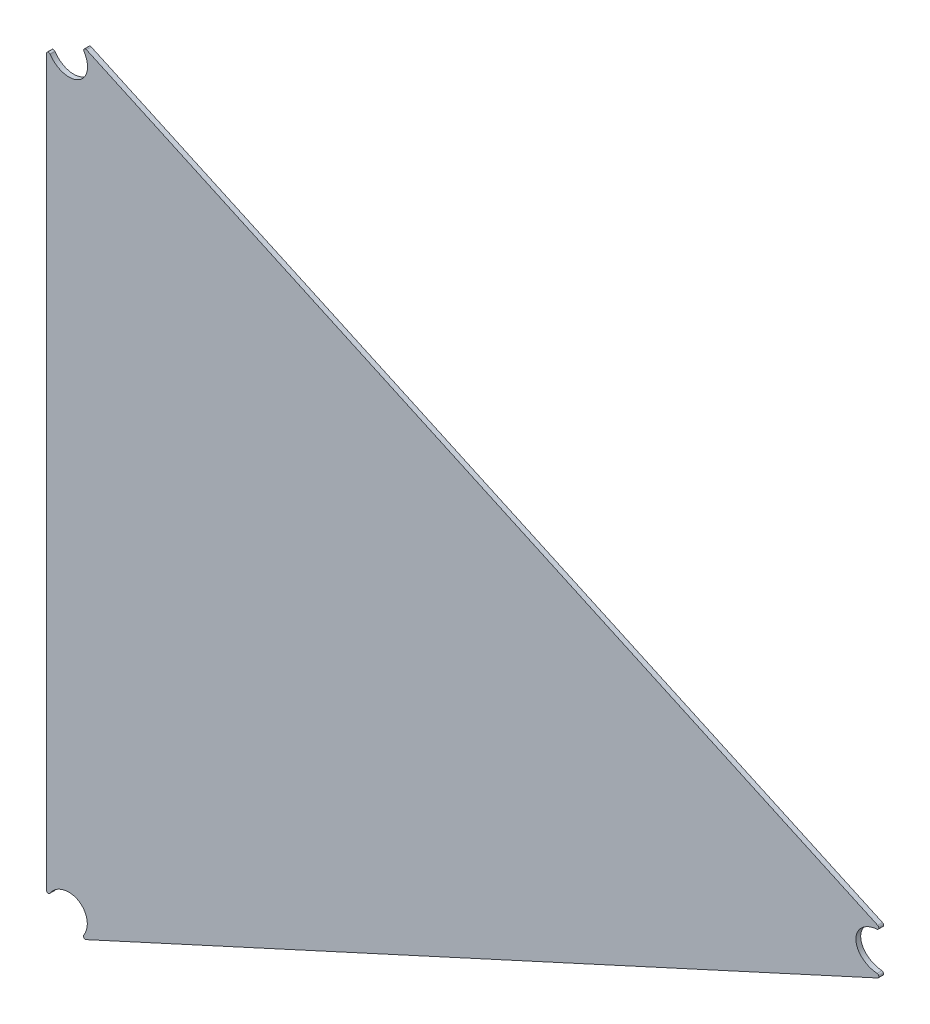
ISO-10303-21;
HEADER;
FILE_DESCRIPTION(('STEP AP214'),'2;1');
FILE_NAME('part.step','',(''),(''),'','','');
FILE_SCHEMA(('AUTOMOTIVE_DESIGN { 1 0 10303 214 1 1 1 1 }'));
ENDSEC;
DATA;
#1=APPLICATION_CONTEXT('core data for automotive mechanical design processes');
#2=APPLICATION_PROTOCOL_DEFINITION('international standard','automotive_design',2000,#1);
#3=PRODUCT_CONTEXT('',#1,'mechanical');
#4=PRODUCT('Part','Part','',(#3));
#5=PRODUCT_RELATED_PRODUCT_CATEGORY('part','',(#4));
#6=PRODUCT_DEFINITION_FORMATION('','',#4);
#7=PRODUCT_DEFINITION_CONTEXT('part definition',#1,'design');
#8=PRODUCT_DEFINITION('design','',#6,#7);
#9=PRODUCT_DEFINITION_SHAPE('','',#8);
#10=(LENGTH_UNIT() NAMED_UNIT(*) SI_UNIT(.MILLI.,.METRE.));
#11=(NAMED_UNIT(*) PLANE_ANGLE_UNIT() SI_UNIT($,.RADIAN.));
#12=(NAMED_UNIT(*) SI_UNIT($,.STERADIAN.) SOLID_ANGLE_UNIT());
#13=UNCERTAINTY_MEASURE_WITH_UNIT(LENGTH_MEASURE(1.E-05),#10,'distance_accuracy_value','');
#14=(GEOMETRIC_REPRESENTATION_CONTEXT(3) GLOBAL_UNCERTAINTY_ASSIGNED_CONTEXT((#13)) GLOBAL_UNIT_ASSIGNED_CONTEXT((#10,
#11,#12)) REPRESENTATION_CONTEXT('',''));
#15=CARTESIAN_POINT('',(0.,0.,0.));
#16=DIRECTION('',(0.,0.,1.));
#17=DIRECTION('',(1.,0.,0.));
#18=AXIS2_PLACEMENT_3D('',#15,#16,#17);
#19=CARTESIAN_POINT('',(57.8169050628692,126.139755846244,3.175));
#20=DIRECTION('',(0.416671685797595,0.909057042354653,0.));
#21=DIRECTION('',(-0.909057042354653,0.416671685797595,0.));
#22=AXIS2_PLACEMENT_3D('',#19,#20,#21);
#23=PLANE('',#22);
#24=DIRECTION('',(0.909057042354653,-0.416671685797595,0.));
#25=VECTOR('',#24,1.);
#26=CARTESIAN_POINT('',(57.8169050628692,126.139755846244,0.));
#27=LINE('',#26,#25);
#28=CARTESIAN_POINT('',(-222.229840165791,254.500842114615,0.));
#29=VERTEX_POINT('',#28);
#30=CARTESIAN_POINT('',(300.164243783286,15.058416097048,0.));
#31=VERTEX_POINT('',#30);
#32=EDGE_CURVE('E157',#29,#31,#27,.T.);
#33=ORIENTED_EDGE('',*,*,#32,.F.);
#34=DIRECTION('',(0.,0.,1.));
#35=VECTOR('',#34,1.);
#36=CARTESIAN_POINT('',(-222.229840165791,254.500842114615,3.175));
#37=LINE('',#36,#35);
#38=CARTESIAN_POINT('',(-222.229840165791,254.500842114615,3.175));
#39=VERTEX_POINT('',#38);
#40=EDGE_CURVE('E135',#29,#39,#37,.T.);
#41=ORIENTED_EDGE('',*,*,#40,.T.);
#42=DIRECTION('',(0.909057042354653,-0.416671685797595,0.));
#43=VECTOR('',#42,1.);
#44=CARTESIAN_POINT('',(57.8169050628692,126.139755846244,3.175));
#45=LINE('',#44,#43);
#46=CARTESIAN_POINT('',(300.164243783286,15.058416097048,3.175));
#47=VERTEX_POINT('',#46);
#48=EDGE_CURVE('E184',#39,#47,#45,.T.);
#49=ORIENTED_EDGE('',*,*,#48,.T.);
#50=DIRECTION('',(0.,0.,1.));
#51=VECTOR('',#50,1.);
#52=CARTESIAN_POINT('',(300.164243783286,15.058416097048,0.));
#53=LINE('',#52,#51);
#54=EDGE_CURVE('E140',#47,#31,#53,.F.);
#55=ORIENTED_EDGE('',*,*,#54,.T.);
#56=EDGE_LOOP('',(#33,#41,#49,#55));
#57=FACE_BOUND('',#56,.T.);
#58=ADVANCED_FACE('F39',(#57),#23,.T.);
#59=CARTESIAN_POINT('',(-224.002225489407,237.681676078556,3.175));
#60=CARTESIAN_POINT('',(-239.666650188727,217.687031824672,3.175));
#61=CARTESIAN_POINT('',(-261.695107658688,234.94480890232,3.175));
#62=CARTESIAN_POINT('',(-246.030682959368,254.939453156203,3.175));
#63=CARTESIAN_POINT('',(-230.366258260048,274.934097410086,3.175));
#64=CARTESIAN_POINT('',(-208.337800790087,257.676320332439,3.175));
#65=CARTESIAN_POINT('',(-224.002225489407,237.681676078556,3.175));
#66=(BOUNDED_CURVE() B_SPLINE_CURVE(3,(#59,#60,#61,#62,#63,#64,#65),.UNSPECIFIED.,.T.,
.F.) B_SPLINE_CURVE_WITH_KNOTS((4,3,4),(0.,0.5,1.),
.UNSPECIFIED.) CURVE() GEOMETRIC_REPRESENTATION_ITEM() RATIONAL_B_SPLINE_CURVE((1.,
0.333333333333333,0.333333333333333,1.,0.333333333333333,0.333333333333333,1.)) REPRESENTATION_ITEM(''));
#67=DIRECTION('',(0.,0.,-1.));
#68=VECTOR('',#67,1.);
#69=SURFACE_OF_LINEAR_EXTRUSION('',#66,#68);
#70=CARTESIAN_POINT('',(-223.822045915518,252.65145733539,3.175));
#71=VERTEX_POINT('',#70);
#72=CARTESIAN_POINT('',(-246.201784178799,239.955800644231,3.175));
#73=VERTEX_POINT('',#72);
#74=EDGE_CURVE('E150',#71,#73,#66,.T.);
#75=ORIENTED_EDGE('',*,*,#74,.F.);
#76=DIRECTION('',(0.,0.,-1.));
#77=VECTOR('',#76,1.);
#78=CARTESIAN_POINT('',(-223.822045915518,252.65145733539,3.175));
#79=LINE('',#78,#77);
#80=CARTESIAN_POINT('',(-223.822045915518,252.651457335391,0.));
#81=VERTEX_POINT('',#80);
#82=EDGE_CURVE('E134',#71,#81,#79,.T.);
#83=ORIENTED_EDGE('',*,*,#82,.T.);
#84=CARTESIAN_POINT('',(-224.002225489407,237.681676078556,0.));
#85=CARTESIAN_POINT('',(-239.666650188727,217.687031824672,0.));
#86=CARTESIAN_POINT('',(-261.695107658688,234.94480890232,0.));
#87=CARTESIAN_POINT('',(-246.030682959368,254.939453156203,0.));
#88=CARTESIAN_POINT('',(-230.366258260048,274.934097410086,0.));
#89=CARTESIAN_POINT('',(-208.337800790087,257.676320332439,0.));
#90=CARTESIAN_POINT('',(-224.002225489407,237.681676078556,0.));
#91=(BOUNDED_CURVE() B_SPLINE_CURVE(3,(#84,#85,#86,#87,#88,#89,#90),.UNSPECIFIED.,.T.,
.F.) B_SPLINE_CURVE_WITH_KNOTS((4,3,4),(0.,0.5,1.),
.UNSPECIFIED.) CURVE() GEOMETRIC_REPRESENTATION_ITEM() RATIONAL_B_SPLINE_CURVE((1.,
0.333333333333333,0.333333333333333,1.,0.333333333333333,0.333333333333333,1.)) REPRESENTATION_ITEM(''));
#92=CARTESIAN_POINT('',(-246.201784178799,239.955800644231,0.));
#93=VERTEX_POINT('',#92);
#94=EDGE_CURVE('E147',#81,#93,#91,.T.);
#95=ORIENTED_EDGE('',*,*,#94,.T.);
#96=DIRECTION('',(0.,0.,-1.));
#97=VECTOR('',#96,1.);
#98=CARTESIAN_POINT('',(-246.201784178799,239.955800644231,0.));
#99=LINE('',#98,#97);
#100=EDGE_CURVE('E152',#93,#73,#99,.F.);
#101=ORIENTED_EDGE('',*,*,#100,.T.);
#102=EDGE_LOOP('',(#75,#83,#95,#101));
#103=FACE_BOUND('',#102,.T.);
#104=ADVANCED_FACE('F146',(#103),#69,.F.);
#105=CARTESIAN_POINT('',(-248.607092407233,0.0759261698948962,3.175));
#106=DIRECTION('',(0.999999953363502,-0.000305406276300412,0.));
#107=DIRECTION('',(0.000305406276300412,0.999999953363502,0.));
#108=AXIS2_PLACEMENT_3D('',#105,#106,#107);
#109=PLANE('',#108);
#110=DIRECTION('',(-0.000305406276300412,-0.999999953363502,0.));
#111=VECTOR('',#110,1.);
#112=CARTESIAN_POINT('',(-248.607092407233,0.0759261698948962,3.175));
#113=LINE('',#112,#111);
#114=CARTESIAN_POINT('',(-248.534044048188,239.260125406702,3.175));
#115=VERTEX_POINT('',#114);
#116=CARTESIAN_POINT('',(-248.680149770112,-239.137754557326,3.175));
#117=VERTEX_POINT('',#116);
#118=EDGE_CURVE('E241',#115,#117,#113,.T.);
#119=ORIENTED_EDGE('',*,*,#118,.F.);
#120=DIRECTION('',(0.,0.,-1.));
#121=VECTOR('',#120,1.);
#122=CARTESIAN_POINT('',(-248.534044048188,239.260125406702,3.175));
#123=LINE('',#122,#121);
#124=CARTESIAN_POINT('',(-248.534044048188,239.260125406702,0.));
#125=VERTEX_POINT('',#124);
#126=EDGE_CURVE('E214',#115,#125,#123,.T.);
#127=ORIENTED_EDGE('',*,*,#126,.T.);
#128=DIRECTION('',(-0.000305406276300412,-0.999999953363502,0.));
#129=VECTOR('',#128,1.);
#130=CARTESIAN_POINT('',(-248.607092407233,0.0759261698948962,0.));
#131=LINE('',#130,#129);
#132=CARTESIAN_POINT('',(-248.680149770112,-239.137754557326,0.));
#133=VERTEX_POINT('',#132);
#134=EDGE_CURVE('E156',#125,#133,#131,.T.);
#135=ORIENTED_EDGE('',*,*,#134,.T.);
#136=DIRECTION('',(0.,0.,-1.));
#137=VECTOR('',#136,1.);
#138=CARTESIAN_POINT('',(-248.680149770112,-239.137754557326,3.175));
#139=LINE('',#138,#137);
#140=EDGE_CURVE('E212',#133,#117,#139,.F.);
#141=ORIENTED_EDGE('',*,*,#140,.T.);
#142=EDGE_LOOP('',(#119,#127,#135,#141));
#143=FACE_BOUND('',#142,.T.);
#144=ADVANCED_FACE('F270',(#143),#109,.F.);
#145=CARTESIAN_POINT('',(-224.153396841427,-237.567806796085,3.175));
#146=CARTESIAN_POINT('',(-208.488972142107,-257.562451049968,3.175));
#147=CARTESIAN_POINT('',(-230.517429612068,-274.820228127615,3.175));
#148=CARTESIAN_POINT('',(-246.181854311388,-254.825583873732,3.175));
#149=CARTESIAN_POINT('',(-261.846279010708,-234.830939619849,3.175));
#150=CARTESIAN_POINT('',(-239.817821540747,-217.573162542202,3.175));
#151=CARTESIAN_POINT('',(-224.153396841427,-237.567806796085,3.175));
#152=(BOUNDED_CURVE() B_SPLINE_CURVE(3,(#145,#146,#147,#148,#149,#150,#151),.UNSPECIFIED.,.T.,
.F.) B_SPLINE_CURVE_WITH_KNOTS((4,3,4),(0.,0.5,1.),
.UNSPECIFIED.) CURVE() GEOMETRIC_REPRESENTATION_ITEM() RATIONAL_B_SPLINE_CURVE((1.,
0.333333333333333,0.333333333333333,1.,0.333333333333333,0.333333333333333,1.)) REPRESENTATION_ITEM(''));
#153=DIRECTION('',(0.,0.,-1.));
#154=VECTOR('',#153,1.);
#155=SURFACE_OF_LINEAR_EXTRUSION('',#152,#154);
#156=CARTESIAN_POINT('',(-246.348287219465,-239.834811496638,3.175));
#157=VERTEX_POINT('',#156);
#158=CARTESIAN_POINT('',(-223.975560954852,-252.541172308136,3.175));
#159=VERTEX_POINT('',#158);
#160=EDGE_CURVE('E230',#157,#159,#152,.T.);
#161=ORIENTED_EDGE('',*,*,#160,.F.);
#162=DIRECTION('',(0.,0.,-1.));
#163=VECTOR('',#162,1.);
#164=CARTESIAN_POINT('',(-246.348287219465,-239.834811496638,3.175));
#165=LINE('',#164,#163);
#166=CARTESIAN_POINT('',(-246.348287219465,-239.834811496638,0.));
#167=VERTEX_POINT('',#166);
#168=EDGE_CURVE('E11',#157,#167,#165,.T.);
#169=ORIENTED_EDGE('',*,*,#168,.T.);
#170=CARTESIAN_POINT('',(-224.153396841427,-237.567806796085,0.));
#171=CARTESIAN_POINT('',(-208.488972142107,-257.562451049968,0.));
#172=CARTESIAN_POINT('',(-230.517429612068,-274.820228127615,0.));
#173=CARTESIAN_POINT('',(-246.181854311388,-254.825583873732,0.));
#174=CARTESIAN_POINT('',(-261.846279010708,-234.830939619849,0.));
#175=CARTESIAN_POINT('',(-239.817821540747,-217.573162542202,0.));
#176=CARTESIAN_POINT('',(-224.153396841427,-237.567806796085,0.));
#177=(BOUNDED_CURVE() B_SPLINE_CURVE(3,(#170,#171,#172,#173,#174,#175,#176),.UNSPECIFIED.,.T.,
.F.) B_SPLINE_CURVE_WITH_KNOTS((4,3,4),(0.,0.5,1.),
.UNSPECIFIED.) CURVE() GEOMETRIC_REPRESENTATION_ITEM() RATIONAL_B_SPLINE_CURVE((1.,
0.333333333333333,0.333333333333333,1.,0.333333333333333,0.333333333333333,1.)) REPRESENTATION_ITEM(''));
#178=CARTESIAN_POINT('',(-223.975560954852,-252.541172308136,0.));
#179=VERTEX_POINT('',#178);
#180=EDGE_CURVE('E160',#167,#179,#177,.T.);
#181=ORIENTED_EDGE('',*,*,#180,.T.);
#182=DIRECTION('',(0.,0.,-1.));
#183=VECTOR('',#182,1.);
#184=CARTESIAN_POINT('',(-223.975560954852,-252.541172308136,0.));
#185=LINE('',#184,#183);
#186=EDGE_CURVE('E47',#179,#159,#185,.F.);
#187=ORIENTED_EDGE('',*,*,#186,.T.);
#188=EDGE_LOOP('',(#161,#169,#181,#187));
#189=FACE_BOUND('',#188,.T.);
#190=ADVANCED_FACE('F229',(#189),#155,.F.);
#191=CARTESIAN_POINT('',(57.7492096910816,-126.085499541676,3.175));
#192=DIRECTION('',(-0.416416470676954,0.909173978372099,0.));
#193=DIRECTION('',(-0.909173978372099,-0.416416470676954,0.));
#194=AXIS2_PLACEMENT_3D('',#191,#192,#193);
#195=PLANE('',#194);
#196=DIRECTION('',(0.909173978372099,0.416416470676954,0.));
#197=VECTOR('',#196,1.);
#198=CARTESIAN_POINT('',(57.7492096910816,-126.085499541676,0.));
#199=LINE('',#198,#197);
#200=CARTESIAN_POINT('',(-222.383878846587,-254.39101072399,0.));
#201=VERTEX_POINT('',#200);
#202=CARTESIAN_POINT('',(300.158458670476,-15.0581204913074,0.));
#203=VERTEX_POINT('',#202);
#204=EDGE_CURVE('E174',#201,#203,#199,.T.);
#205=ORIENTED_EDGE('',*,*,#204,.T.);
#206=DIRECTION('',(0.,0.,-1.));
#207=VECTOR('',#206,1.);
#208=CARTESIAN_POINT('',(300.158458670476,-15.0581204913074,3.175));
#209=LINE('',#208,#207);
#210=CARTESIAN_POINT('',(300.158458670476,-15.0581204913074,3.175));
#211=VERTEX_POINT('',#210);
#212=EDGE_CURVE('E224',#203,#211,#209,.F.);
#213=ORIENTED_EDGE('',*,*,#212,.T.);
#214=DIRECTION('',(0.909173978372099,0.416416470676954,0.));
#215=VECTOR('',#214,1.);
#216=CARTESIAN_POINT('',(57.7492096910816,-126.085499541676,3.175));
#217=LINE('',#216,#215);
#218=CARTESIAN_POINT('',(-222.383878846587,-254.39101072399,3.175));
#219=VERTEX_POINT('',#218);
#220=EDGE_CURVE('E240',#219,#211,#217,.T.);
#221=ORIENTED_EDGE('',*,*,#220,.F.);
#222=DIRECTION('',(0.,0.,-1.));
#223=VECTOR('',#222,1.);
#224=CARTESIAN_POINT('',(-222.383878846587,-254.39101072399,3.175));
#225=LINE('',#224,#223);
#226=EDGE_CURVE('E221',#219,#201,#225,.T.);
#227=ORIENTED_EDGE('',*,*,#226,.T.);
#228=EDGE_LOOP('',(#205,#213,#221,#227));
#229=FACE_BOUND('',#228,.T.);
#230=ADVANCED_FACE('F246',(#229),#195,.F.);
#231=CARTESIAN_POINT('',(285.763127193445,0.,3.175));
#232=CARTESIAN_POINT('',(285.763127193445,25.4,3.175));
#233=CARTESIAN_POINT('',(316.770801747986,25.4,3.175));
#234=CARTESIAN_POINT('',(316.770801747986,0.,3.175));
#235=CARTESIAN_POINT('',(316.770801747986,-25.4,3.175));
#236=CARTESIAN_POINT('',(285.763127193445,-25.4,3.175));
#237=CARTESIAN_POINT('',(285.763127193445,0.,3.175));
#238=(BOUNDED_CURVE() B_SPLINE_CURVE(3,(#231,#232,#233,#234,#235,#236,#237),.UNSPECIFIED.,.T.,
.F.) B_SPLINE_CURVE_WITH_KNOTS((4,3,4),(0.,0.5,1.),
.UNSPECIFIED.) CURVE() GEOMETRIC_REPRESENTATION_ITEM() RATIONAL_B_SPLINE_CURVE((1.,
0.333333333333333,0.333333333333333,1.,0.333333333333333,0.333333333333333,1.)) REPRESENTATION_ITEM(''));
#239=DIRECTION('',(0.,0.,-1.));
#240=VECTOR('',#239,1.);
#241=SURFACE_OF_LINEAR_EXTRUSION('',#238,#240);
#242=CARTESIAN_POINT('',(299.73272500535,-12.6376625848224,3.175));
#243=VERTEX_POINT('',#242);
#244=CARTESIAN_POINT('',(299.737841043515,12.6380786461604,3.175));
#245=VERTEX_POINT('',#244);
#246=EDGE_CURVE('E188',#243,#245,#238,.T.);
#247=ORIENTED_EDGE('',*,*,#246,.F.);
#248=DIRECTION('',(0.,0.,-1.));
#249=VECTOR('',#248,1.);
#250=CARTESIAN_POINT('',(299.73272500535,-12.6376625848224,3.175));
#251=LINE('',#250,#249);
#252=CARTESIAN_POINT('',(299.73272500535,-12.6376625848224,0.));
#253=VERTEX_POINT('',#252);
#254=EDGE_CURVE('E218',#243,#253,#251,.T.);
#255=ORIENTED_EDGE('',*,*,#254,.T.);
#256=CARTESIAN_POINT('',(285.763127193445,0.,0.));
#257=CARTESIAN_POINT('',(285.763127193445,25.4,0.));
#258=CARTESIAN_POINT('',(316.770801747986,25.4,0.));
#259=CARTESIAN_POINT('',(316.770801747986,0.,0.));
#260=CARTESIAN_POINT('',(316.770801747986,-25.4,0.));
#261=CARTESIAN_POINT('',(285.763127193445,-25.4,0.));
#262=CARTESIAN_POINT('',(285.763127193445,0.,0.));
#263=(BOUNDED_CURVE() B_SPLINE_CURVE(3,(#256,#257,#258,#259,#260,#261,#262),.UNSPECIFIED.,.T.,
.F.) B_SPLINE_CURVE_WITH_KNOTS((4,3,4),(0.,0.5,1.),
.UNSPECIFIED.) CURVE() GEOMETRIC_REPRESENTATION_ITEM() RATIONAL_B_SPLINE_CURVE((1.,
0.333333333333333,0.333333333333333,1.,0.333333333333333,0.333333333333333,1.)) REPRESENTATION_ITEM(''));
#264=CARTESIAN_POINT('',(299.737841043515,12.6380786461604,0.));
#265=VERTEX_POINT('',#264);
#266=EDGE_CURVE('E180',#253,#265,#263,.T.);
#267=ORIENTED_EDGE('',*,*,#266,.T.);
#268=DIRECTION('',(0.,0.,-1.));
#269=VECTOR('',#268,1.);
#270=CARTESIAN_POINT('',(299.737841043515,12.6380786461604,0.));
#271=LINE('',#270,#269);
#272=EDGE_CURVE('E54',#265,#245,#271,.F.);
#273=ORIENTED_EDGE('',*,*,#272,.T.);
#274=EDGE_LOOP('',(#247,#255,#267,#273));
#275=FACE_BOUND('',#274,.T.);
#276=ADVANCED_FACE('F252',(#275),#241,.F.);
#277=CARTESIAN_POINT('',(0.,0.,3.175));
#278=DIRECTION('',(0.,0.,1.));
#279=DIRECTION('',(1.,0.,0.));
#280=AXIS2_PLACEMENT_3D('',#277,#278,#279);
#281=PLANE('',#280);
#282=ORIENTED_EDGE('',*,*,#48,.F.);
#283=CARTESIAN_POINT('',(-222.759013206754,253.346339670824,3.175));
#284=DIRECTION('',(0.,0.,1.));
#285=DIRECTION('',(1.,0.,0.));
#286=AXIS2_PLACEMENT_3D('',#283,#284,#285);
#287=CIRCLE('',#286,1.27);
#288=EDGE_CURVE('E210',#39,#71,#287,.T.);
#289=ORIENTED_EDGE('',*,*,#288,.T.);
#290=ORIENTED_EDGE('',*,*,#74,.T.);
#291=CARTESIAN_POINT('',(-247.264044107416,239.259737540731,3.175));
#292=DIRECTION('',(0.,0.,1.));
#293=DIRECTION('',(1.,0.,0.));
#294=AXIS2_PLACEMENT_3D('',#291,#292,#293);
#295=CIRCLE('',#294,1.27);
#296=EDGE_CURVE('E208',#73,#115,#295,.T.);
#297=ORIENTED_EDGE('',*,*,#296,.T.);
#298=ORIENTED_EDGE('',*,*,#118,.T.);
#299=CARTESIAN_POINT('',(-247.41014982934,-239.138142423297,3.175));
#300=DIRECTION('',(0.,0.,1.));
#301=DIRECTION('',(1.,0.,0.));
#302=AXIS2_PLACEMENT_3D('',#299,#300,#301);
#303=CIRCLE('',#302,1.27);
#304=EDGE_CURVE('E203',#117,#157,#303,.T.);
#305=ORIENTED_EDGE('',*,*,#304,.T.);
#306=ORIENTED_EDGE('',*,*,#160,.T.);
#307=CARTESIAN_POINT('',(-222.912727764347,-253.236359771458,3.175));
#308=DIRECTION('',(0.,0.,1.));
#309=DIRECTION('',(1.,0.,0.));
#310=AXIS2_PLACEMENT_3D('',#307,#308,#309);
#311=CIRCLE('',#310,1.27);
#312=EDGE_CURVE('E201',#159,#219,#311,.T.);
#313=ORIENTED_EDGE('',*,*,#312,.T.);
#314=ORIENTED_EDGE('',*,*,#220,.T.);
#315=CARTESIAN_POINT('',(299.629609752716,-13.9034695387748,3.175));
#316=DIRECTION('',(0.,0.,1.));
#317=DIRECTION('',(1.,0.,0.));
#318=AXIS2_PLACEMENT_3D('',#315,#316,#317);
#319=CIRCLE('',#318,1.27);
#320=EDGE_CURVE('E61',#211,#243,#319,.T.);
#321=ORIENTED_EDGE('',*,*,#320,.T.);
#322=ORIENTED_EDGE('',*,*,#246,.T.);
#323=CARTESIAN_POINT('',(299.635070742323,13.9039136532576,3.175));
#324=DIRECTION('',(0.,0.,1.));
#325=DIRECTION('',(1.,0.,0.));
#326=AXIS2_PLACEMENT_3D('',#323,#324,#325);
#327=CIRCLE('',#326,1.27);
#328=EDGE_CURVE('E205',#245,#47,#327,.T.);
#329=ORIENTED_EDGE('',*,*,#328,.T.);
#330=EDGE_LOOP('',(#282,#289,#290,#297,#298,#305,#306,#313,#314,#321,#322,#329));
#331=FACE_BOUND('',#330,.T.);
#332=ADVANCED_FACE('F236',(#331),#281,.T.);
#333=CARTESIAN_POINT('',(0.,0.,0.));
#334=DIRECTION('',(0.,0.,1.));
#335=DIRECTION('',(1.,0.,0.));
#336=AXIS2_PLACEMENT_3D('',#333,#334,#335);
#337=PLANE('',#336);
#338=ORIENTED_EDGE('',*,*,#94,.F.);
#339=CARTESIAN_POINT('',(-222.759013206754,253.346339670824,0.));
#340=DIRECTION('',(0.,0.,1.));
#341=DIRECTION('',(1.,0.,0.));
#342=AXIS2_PLACEMENT_3D('',#339,#340,#341);
#343=CIRCLE('',#342,1.27);
#344=EDGE_CURVE('E130',#81,#29,#343,.F.);
#345=ORIENTED_EDGE('',*,*,#344,.T.);
#346=ORIENTED_EDGE('',*,*,#32,.T.);
#347=CARTESIAN_POINT('',(299.635070742323,13.9039136532576,0.));
#348=DIRECTION('',(0.,0.,1.));
#349=DIRECTION('',(1.,0.,0.));
#350=AXIS2_PLACEMENT_3D('',#347,#348,#349);
#351=CIRCLE('',#350,1.27);
#352=EDGE_CURVE('E193',#31,#265,#351,.F.);
#353=ORIENTED_EDGE('',*,*,#352,.T.);
#354=ORIENTED_EDGE('',*,*,#266,.F.);
#355=CARTESIAN_POINT('',(299.629609752716,-13.9034695387748,0.));
#356=DIRECTION('',(0.,0.,1.));
#357=DIRECTION('',(1.,0.,0.));
#358=AXIS2_PLACEMENT_3D('',#355,#356,#357);
#359=CIRCLE('',#358,1.27);
#360=EDGE_CURVE('E195',#253,#203,#359,.F.);
#361=ORIENTED_EDGE('',*,*,#360,.T.);
#362=ORIENTED_EDGE('',*,*,#204,.F.);
#363=CARTESIAN_POINT('',(-222.912727764347,-253.236359771458,0.));
#364=DIRECTION('',(0.,0.,1.));
#365=DIRECTION('',(1.,0.,0.));
#366=AXIS2_PLACEMENT_3D('',#363,#364,#365);
#367=CIRCLE('',#366,1.27);
#368=EDGE_CURVE('E151',#201,#179,#367,.F.);
#369=ORIENTED_EDGE('',*,*,#368,.T.);
#370=ORIENTED_EDGE('',*,*,#180,.F.);
#371=CARTESIAN_POINT('',(-247.41014982934,-239.138142423297,0.));
#372=DIRECTION('',(0.,0.,1.));
#373=DIRECTION('',(1.,0.,0.));
#374=AXIS2_PLACEMENT_3D('',#371,#372,#373);
#375=CIRCLE('',#374,1.27);
#376=EDGE_CURVE('E191',#167,#133,#375,.F.);
#377=ORIENTED_EDGE('',*,*,#376,.T.);
#378=ORIENTED_EDGE('',*,*,#134,.F.);
#379=CARTESIAN_POINT('',(-247.264044107416,239.259737540731,0.));
#380=DIRECTION('',(0.,0.,1.));
#381=DIRECTION('',(1.,0.,0.));
#382=AXIS2_PLACEMENT_3D('',#379,#380,#381);
#383=CIRCLE('',#382,1.27);
#384=EDGE_CURVE('E141',#125,#93,#383,.F.);
#385=ORIENTED_EDGE('',*,*,#384,.T.);
#386=EDGE_LOOP('',(#338,#345,#346,#353,#354,#361,#362,#369,#370,#377,#378,#385));
#387=FACE_BOUND('',#386,.T.);
#388=ADVANCED_FACE('F154',(#387),#337,.F.);
#389=CARTESIAN_POINT('',(-222.759013206754,253.346339670824,1.5875));
#390=DIRECTION('',(0.,0.,-1.));
#391=DIRECTION('',(-1.,0.,0.));
#392=AXIS2_PLACEMENT_3D('',#389,#390,#391);
#393=CYLINDRICAL_SURFACE('',#392,1.27);
#394=ORIENTED_EDGE('',*,*,#288,.F.);
#395=ORIENTED_EDGE('',*,*,#40,.F.);
#396=ORIENTED_EDGE('',*,*,#344,.F.);
#397=ORIENTED_EDGE('',*,*,#82,.F.);
#398=EDGE_LOOP('',(#394,#395,#396,#397));
#399=FACE_BOUND('',#398,.T.);
#400=ADVANCED_FACE('F133',(#399),#393,.T.);
#401=CARTESIAN_POINT('',(-247.264044107416,239.259737540731,1.5875));
#402=DIRECTION('',(0.,0.,-1.));
#403=DIRECTION('',(-1.,0.,0.));
#404=AXIS2_PLACEMENT_3D('',#401,#402,#403);
#405=CYLINDRICAL_SURFACE('',#404,1.27);
#406=ORIENTED_EDGE('',*,*,#296,.F.);
#407=ORIENTED_EDGE('',*,*,#100,.F.);
#408=ORIENTED_EDGE('',*,*,#384,.F.);
#409=ORIENTED_EDGE('',*,*,#126,.F.);
#410=EDGE_LOOP('',(#406,#407,#408,#409));
#411=FACE_BOUND('',#410,.T.);
#412=ADVANCED_FACE('F294',(#411),#405,.T.);
#413=CARTESIAN_POINT('',(299.629609752716,-13.9034695387748,1.5875));
#414=DIRECTION('',(0.,0.,-1.));
#415=DIRECTION('',(-1.,0.,0.));
#416=AXIS2_PLACEMENT_3D('',#413,#414,#415);
#417=CYLINDRICAL_SURFACE('',#416,1.27);
#418=ORIENTED_EDGE('',*,*,#320,.F.);
#419=ORIENTED_EDGE('',*,*,#212,.F.);
#420=ORIENTED_EDGE('',*,*,#360,.F.);
#421=ORIENTED_EDGE('',*,*,#254,.F.);
#422=EDGE_LOOP('',(#418,#419,#420,#421));
#423=FACE_BOUND('',#422,.T.);
#424=ADVANCED_FACE('F251',(#423),#417,.T.);
#425=CARTESIAN_POINT('',(299.635070742323,13.9039136532576,1.5875));
#426=DIRECTION('',(0.,0.,-1.));
#427=DIRECTION('',(-1.,0.,0.));
#428=AXIS2_PLACEMENT_3D('',#425,#426,#427);
#429=CYLINDRICAL_SURFACE('',#428,1.27);
#430=ORIENTED_EDGE('',*,*,#328,.F.);
#431=ORIENTED_EDGE('',*,*,#272,.F.);
#432=ORIENTED_EDGE('',*,*,#352,.F.);
#433=ORIENTED_EDGE('',*,*,#54,.F.);
#434=EDGE_LOOP('',(#430,#431,#432,#433));
#435=FACE_BOUND('',#434,.T.);
#436=ADVANCED_FACE('F300',(#435),#429,.T.);
#437=CARTESIAN_POINT('',(-247.41014982934,-239.138142423297,1.5875));
#438=DIRECTION('',(0.,0.,-1.));
#439=DIRECTION('',(-1.,0.,0.));
#440=AXIS2_PLACEMENT_3D('',#437,#438,#439);
#441=CYLINDRICAL_SURFACE('',#440,1.27);
#442=ORIENTED_EDGE('',*,*,#304,.F.);
#443=ORIENTED_EDGE('',*,*,#140,.F.);
#444=ORIENTED_EDGE('',*,*,#376,.F.);
#445=ORIENTED_EDGE('',*,*,#168,.F.);
#446=EDGE_LOOP('',(#442,#443,#444,#445));
#447=FACE_BOUND('',#446,.T.);
#448=ADVANCED_FACE('F302',(#447),#441,.T.);
#449=CARTESIAN_POINT('',(-222.912727764347,-253.236359771458,1.5875));
#450=DIRECTION('',(0.,0.,-1.));
#451=DIRECTION('',(-1.,0.,0.));
#452=AXIS2_PLACEMENT_3D('',#449,#450,#451);
#453=CYLINDRICAL_SURFACE('',#452,1.27);
#454=ORIENTED_EDGE('',*,*,#312,.F.);
#455=ORIENTED_EDGE('',*,*,#186,.F.);
#456=ORIENTED_EDGE('',*,*,#368,.F.);
#457=ORIENTED_EDGE('',*,*,#226,.F.);
#458=EDGE_LOOP('',(#454,#455,#456,#457));
#459=FACE_BOUND('',#458,.T.);
#460=ADVANCED_FACE('F41',(#459),#453,.T.);
#461=CLOSED_SHELL('',(#58,#104,#144,#190,#230,#276,#332,#388,#400,#412,#424,#436,#448,#460));
#462=MANIFOLD_SOLID_BREP('B2',#461);
#463=ADVANCED_BREP_SHAPE_REPRESENTATION('',(#18,#462),#14);
#464=SHAPE_DEFINITION_REPRESENTATION(#9,#463);
ENDSEC;
END-ISO-10303-21;
